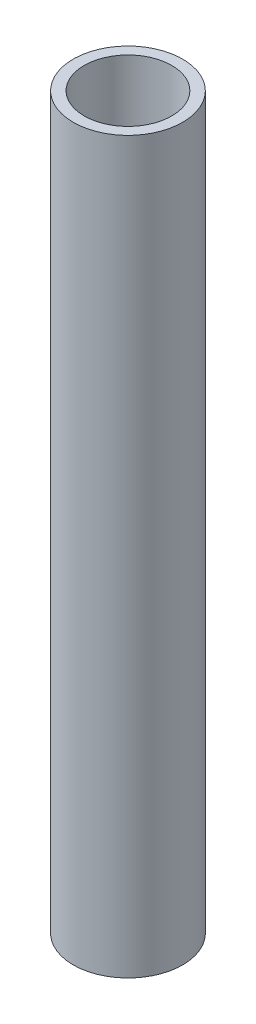
ISO-10303-21;
HEADER;
FILE_DESCRIPTION(('STEP AP214'),'2;1');
FILE_NAME('part.step','',(''),(''),'','','');
FILE_SCHEMA(('AUTOMOTIVE_DESIGN { 1 0 10303 214 1 1 1 1 }'));
ENDSEC;
DATA;
#1=APPLICATION_CONTEXT('core data for automotive mechanical design processes');
#2=APPLICATION_PROTOCOL_DEFINITION('international standard','automotive_design',2000,#1);
#3=PRODUCT_CONTEXT('',#1,'mechanical');
#4=PRODUCT('Part','Part','',(#3));
#5=PRODUCT_RELATED_PRODUCT_CATEGORY('part','',(#4));
#6=PRODUCT_DEFINITION_FORMATION('','',#4);
#7=PRODUCT_DEFINITION_CONTEXT('part definition',#1,'design');
#8=PRODUCT_DEFINITION('design','',#6,#7);
#9=PRODUCT_DEFINITION_SHAPE('','',#8);
#10=(LENGTH_UNIT() NAMED_UNIT(*) SI_UNIT(.MILLI.,.METRE.));
#11=(NAMED_UNIT(*) PLANE_ANGLE_UNIT() SI_UNIT($,.RADIAN.));
#12=(NAMED_UNIT(*) SI_UNIT($,.STERADIAN.) SOLID_ANGLE_UNIT());
#13=UNCERTAINTY_MEASURE_WITH_UNIT(LENGTH_MEASURE(1.E-05),#10,'distance_accuracy_value','');
#14=(GEOMETRIC_REPRESENTATION_CONTEXT(3) GLOBAL_UNCERTAINTY_ASSIGNED_CONTEXT((#13)) GLOBAL_UNIT_ASSIGNED_CONTEXT((#10,
#11,#12)) REPRESENTATION_CONTEXT('',''));
#15=CARTESIAN_POINT('',(0.,0.,0.));
#16=DIRECTION('',(0.,0.,1.));
#17=DIRECTION('',(1.,0.,0.));
#18=AXIS2_PLACEMENT_3D('',#15,#16,#17);
#19=CARTESIAN_POINT('',(0.,-200.,0.));
#20=DIRECTION('',(0.,1.,0.));
#21=DIRECTION('',(0.,0.,1.));
#22=AXIS2_PLACEMENT_3D('',#19,#20,#21);
#23=PLANE('',#22);
#24=CARTESIAN_POINT('',(0.,-200.,0.));
#25=DIRECTION('',(0.,1.,0.));
#26=DIRECTION('',(0.,0.,1.));
#27=AXIS2_PLACEMENT_3D('',#24,#25,#26);
#28=CIRCLE('',#27,15.);
#29=CARTESIAN_POINT('',(0.,-200.,15.));
#30=VERTEX_POINT('',#29);
#31=EDGE_CURVE('E10',#30,#30,#28,.T.);
#32=ORIENTED_EDGE('',*,*,#31,.F.);
#33=EDGE_LOOP('',(#32));
#34=FACE_BOUND('',#33,.T.);
#35=CARTESIAN_POINT('',(0.,-200.,0.));
#36=DIRECTION('',(0.,-1.,0.));
#37=DIRECTION('',(0.,0.,-1.));
#38=AXIS2_PLACEMENT_3D('',#35,#36,#37);
#39=CIRCLE('',#38,3.);
#40=CARTESIAN_POINT('',(0.,-200.,-3.));
#41=VERTEX_POINT('',#40);
#42=EDGE_CURVE('E65',#41,#41,#39,.T.);
#43=ORIENTED_EDGE('',*,*,#42,.F.);
#44=EDGE_LOOP('',(#43));
#45=FACE_BOUND('',#44,.T.);
#46=ADVANCED_FACE('F43',(#34,#45),#23,.F.);
#47=CARTESIAN_POINT('',(0.,-200.,0.));
#48=DIRECTION('',(0.,1.,0.));
#49=DIRECTION('',(0.,0.,1.));
#50=AXIS2_PLACEMENT_3D('',#47,#48,#49);
#51=CYLINDRICAL_SURFACE('',#50,15.);
#52=ORIENTED_EDGE('',*,*,#31,.T.);
#53=EDGE_LOOP('',(#52));
#54=FACE_BOUND('',#53,.T.);
#55=CARTESIAN_POINT('',(0.,0.,0.));
#56=DIRECTION('',(0.,1.,0.));
#57=DIRECTION('',(0.,0.,1.));
#58=AXIS2_PLACEMENT_3D('',#55,#56,#57);
#59=CIRCLE('',#58,15.);
#60=CARTESIAN_POINT('',(0.,0.,15.));
#61=VERTEX_POINT('',#60);
#62=EDGE_CURVE('E47',#61,#61,#59,.T.);
#63=ORIENTED_EDGE('',*,*,#62,.F.);
#64=EDGE_LOOP('',(#63));
#65=FACE_BOUND('',#64,.T.);
#66=ADVANCED_FACE('F45',(#54,#65),#51,.T.);
#67=CARTESIAN_POINT('',(0.,0.,0.));
#68=DIRECTION('',(0.,1.,0.));
#69=DIRECTION('',(0.,0.,1.));
#70=AXIS2_PLACEMENT_3D('',#67,#68,#69);
#71=PLANE('',#70);
#72=CARTESIAN_POINT('',(0.,0.,0.));
#73=DIRECTION('',(0.,1.,0.));
#74=DIRECTION('',(0.,0.,1.));
#75=AXIS2_PLACEMENT_3D('',#72,#73,#74);
#76=CIRCLE('',#75,12.);
#77=CARTESIAN_POINT('',(0.,0.,12.));
#78=VERTEX_POINT('',#77);
#79=EDGE_CURVE('E57',#78,#78,#76,.T.);
#80=ORIENTED_EDGE('',*,*,#79,.F.);
#81=EDGE_LOOP('',(#80));
#82=FACE_BOUND('',#81,.T.);
#83=ORIENTED_EDGE('',*,*,#62,.T.);
#84=EDGE_LOOP('',(#83));
#85=FACE_BOUND('',#84,.T.);
#86=ADVANCED_FACE('F83',(#82,#85),#71,.T.);
#87=CARTESIAN_POINT('',(0.,-190.,0.));
#88=DIRECTION('',(0.,1.,0.));
#89=DIRECTION('',(0.,0.,1.));
#90=AXIS2_PLACEMENT_3D('',#87,#88,#89);
#91=CYLINDRICAL_SURFACE('',#90,12.);
#92=CARTESIAN_POINT('',(0.,-190.,0.));
#93=DIRECTION('',(0.,1.,0.));
#94=DIRECTION('',(0.,0.,1.));
#95=AXIS2_PLACEMENT_3D('',#92,#93,#94);
#96=CIRCLE('',#95,12.);
#97=CARTESIAN_POINT('',(0.,-190.,12.));
#98=VERTEX_POINT('',#97);
#99=EDGE_CURVE('E55',#98,#98,#96,.T.);
#100=ORIENTED_EDGE('',*,*,#99,.F.);
#101=EDGE_LOOP('',(#100));
#102=FACE_BOUND('',#101,.T.);
#103=ORIENTED_EDGE('',*,*,#79,.T.);
#104=EDGE_LOOP('',(#103));
#105=FACE_BOUND('',#104,.T.);
#106=ADVANCED_FACE('F85',(#102,#105),#91,.F.);
#107=CARTESIAN_POINT('',(0.,-190.,0.));
#108=DIRECTION('',(0.,1.,0.));
#109=DIRECTION('',(0.,0.,1.));
#110=AXIS2_PLACEMENT_3D('',#107,#108,#109);
#111=PLANE('',#110);
#112=CARTESIAN_POINT('',(0.,-190.,0.));
#113=DIRECTION('',(0.,1.,0.));
#114=DIRECTION('',(0.,0.,1.));
#115=AXIS2_PLACEMENT_3D('',#112,#113,#114);
#116=CIRCLE('',#115,3.);
#117=CARTESIAN_POINT('',(0.,-190.,3.));
#118=VERTEX_POINT('',#117);
#119=EDGE_CURVE('E60',#118,#118,#116,.T.);
#120=ORIENTED_EDGE('',*,*,#119,.F.);
#121=EDGE_LOOP('',(#120));
#122=FACE_BOUND('',#121,.T.);
#123=ORIENTED_EDGE('',*,*,#99,.T.);
#124=EDGE_LOOP('',(#123));
#125=FACE_BOUND('',#124,.T.);
#126=ADVANCED_FACE('F92',(#122,#125),#111,.T.);
#127=CARTESIAN_POINT('',(0.,-200.,0.));
#128=DIRECTION('',(0.,-1.,0.));
#129=DIRECTION('',(0.,0.,-1.));
#130=AXIS2_PLACEMENT_3D('',#127,#128,#129);
#131=CYLINDRICAL_SURFACE('',#130,3.);
#132=ORIENTED_EDGE('',*,*,#119,.T.);
#133=EDGE_LOOP('',(#132));
#134=FACE_BOUND('',#133,.T.);
#135=ORIENTED_EDGE('',*,*,#42,.T.);
#136=EDGE_LOOP('',(#135));
#137=FACE_BOUND('',#136,.T.);
#138=ADVANCED_FACE('F73',(#134,#137),#131,.F.);
#139=CLOSED_SHELL('',(#46,#66,#86,#106,#126,#138));
#140=MANIFOLD_SOLID_BREP('B2',#139);
#141=ADVANCED_BREP_SHAPE_REPRESENTATION('',(#18,#140),#14);
#142=SHAPE_DEFINITION_REPRESENTATION(#9,#141);
ENDSEC;
END-ISO-10303-21;
